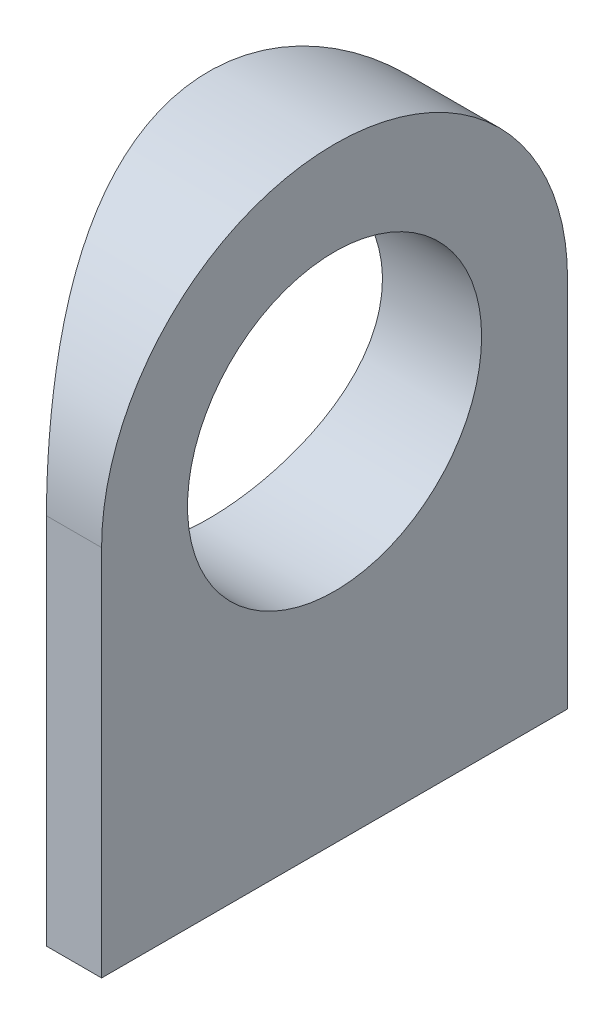
ISO-10303-21;
HEADER;
FILE_DESCRIPTION(('STEP AP214'),'2;1');
FILE_NAME('part.step','',(''),(''),'','','');
FILE_SCHEMA(('AUTOMOTIVE_DESIGN { 1 0 10303 214 1 1 1 1 }'));
ENDSEC;
DATA;
#1=APPLICATION_CONTEXT('core data for automotive mechanical design processes');
#2=APPLICATION_PROTOCOL_DEFINITION('international standard','automotive_design',2000,#1);
#3=PRODUCT_CONTEXT('',#1,'mechanical');
#4=PRODUCT('Part','Part','',(#3));
#5=PRODUCT_RELATED_PRODUCT_CATEGORY('part','',(#4));
#6=PRODUCT_DEFINITION_FORMATION('','',#4);
#7=PRODUCT_DEFINITION_CONTEXT('part definition',#1,'design');
#8=PRODUCT_DEFINITION('design','',#6,#7);
#9=PRODUCT_DEFINITION_SHAPE('','',#8);
#10=(LENGTH_UNIT() NAMED_UNIT(*) SI_UNIT(.MILLI.,.METRE.));
#11=(NAMED_UNIT(*) PLANE_ANGLE_UNIT() SI_UNIT($,.RADIAN.));
#12=(NAMED_UNIT(*) SI_UNIT($,.STERADIAN.) SOLID_ANGLE_UNIT());
#13=UNCERTAINTY_MEASURE_WITH_UNIT(LENGTH_MEASURE(1.E-05),#10,'distance_accuracy_value','');
#14=(GEOMETRIC_REPRESENTATION_CONTEXT(3) GLOBAL_UNCERTAINTY_ASSIGNED_CONTEXT((#13)) GLOBAL_UNIT_ASSIGNED_CONTEXT((#10,
#11,#12)) REPRESENTATION_CONTEXT('',''));
#15=CARTESIAN_POINT('',(0.,0.,0.));
#16=DIRECTION('',(0.,0.,1.));
#17=DIRECTION('',(1.,0.,0.));
#18=AXIS2_PLACEMENT_3D('',#15,#16,#17);
#19=CARTESIAN_POINT('',(0.,0.,0.));
#20=DIRECTION('',(0.,1.,0.));
#21=DIRECTION('',(1.,0.,0.));
#22=AXIS2_PLACEMENT_3D('',#19,#20,#21);
#23=CYLINDRICAL_SURFACE('',#22,28.575);
#24=CARTESIAN_POINT('',(0.,31.75,0.));
#25=DIRECTION('',(0.,1.,0.));
#26=DIRECTION('',(0.,0.,1.));
#27=AXIS2_PLACEMENT_3D('',#24,#25,#26);
#28=CIRCLE('',#27,28.575);
#29=CARTESIAN_POINT('',(-23.7595244060145,31.75,15.875));
#30=VERTEX_POINT('',#29);
#31=CARTESIAN_POINT('',(-23.7595244060145,31.75,-15.875));
#32=VERTEX_POINT('',#31);
#33=EDGE_CURVE('E69',#30,#32,#28,.F.);
#34=ORIENTED_EDGE('',*,*,#33,.F.);
#35=DIRECTION('',(0.,1.,0.));
#36=VECTOR('',#35,1.);
#37=CARTESIAN_POINT('',(-23.7595244060145,0.,15.875));
#38=LINE('',#37,#36);
#39=CARTESIAN_POINT('',(-23.7595244060145,57.1499999589797,15.875));
#40=VERTEX_POINT('',#39);
#41=EDGE_CURVE('E76',#30,#40,#38,.T.);
#42=ORIENTED_EDGE('',*,*,#41,.T.);
#43=CARTESIAN_POINT('',(-23.7595244060145,57.1499999179593,15.875));
#44=CARTESIAN_POINT('',(-23.7595185449954,57.3541036950999,15.8750019816183));
#45=CARTESIAN_POINT('',(-23.7621555680952,57.5581772709929,15.8710628454371));
#46=CARTESIAN_POINT('',(-23.7726559492257,57.9658758219559,15.8553330107876));
#47=CARTESIAN_POINT('',(-23.7805190161914,58.1695008213759,15.8435427495884));
#48=CARTESIAN_POINT('',(-23.8118370036421,58.7787349560772,15.7964730636468));
#49=CARTESIAN_POINT('',(-23.8430209545626,59.1831264803976,15.7494945981294));
#50=CARTESIAN_POINT('',(-23.92446405931,59.982326208514,15.6254934749382));
#51=CARTESIAN_POINT('',(-23.9745894180464,60.3771814255318,15.5486814469622));
#52=CARTESIAN_POINT('',(-24.092046322525,61.1575591658411,15.3660566010382));
#53=CARTESIAN_POINT('',(-24.1593805741403,61.5430802110108,15.2602392221887));
#54=CARTESIAN_POINT('',(-24.3086994034816,62.3012782026588,15.0212357030639));
#55=CARTESIAN_POINT('',(-24.3906399134186,62.673989869078,14.8881317114165));
#56=CARTESIAN_POINT('',(-24.5667570724635,63.4059388073287,14.5956906387931));
#57=CARTESIAN_POINT('',(-24.6609334628652,63.7651763638397,14.4363541124387));
#58=CARTESIAN_POINT('',(-24.8590615946505,64.4693100244829,14.0924486937061));
#59=CARTESIAN_POINT('',(-24.9630292178947,64.8141814725493,13.9078385784149));
#60=CARTESIAN_POINT('',(-25.1780281922563,65.4878695908405,13.5147226038935));
#61=CARTESIAN_POINT('',(-25.2890621468022,65.8166802640544,13.3062079146287));
#62=CARTESIAN_POINT('',(-25.5272180363911,66.4898539387265,12.8439126350057));
#63=CARTESIAN_POINT('',(-25.6548236990183,66.8323662960165,12.5876834820811));
#64=CARTESIAN_POINT('',(-25.9122324335821,67.4951467342908,12.0488995160386));
#65=CARTESIAN_POINT('',(-26.0420356373702,67.8154134746218,11.7663431186829));
#66=CARTESIAN_POINT('',(-26.300794497628,68.4325218853154,11.1759896631967));
#67=CARTESIAN_POINT('',(-26.4297496520425,68.7293506557452,10.868178892833));
#68=CARTESIAN_POINT('',(-26.6837098858186,69.2978401617226,10.2288094213462));
#69=CARTESIAN_POINT('',(-26.8087162405385,69.569509079151,9.8972585030535));
#70=CARTESIAN_POINT('',(-27.0627817843816,70.1091968212958,9.18113864685375));
#71=CARTESIAN_POINT('',(-27.1912132491409,70.3747438965267,8.79447674634559));
#72=CARTESIAN_POINT('',(-27.4365111371155,70.8720234721498,7.99642044158475));
#73=CARTESIAN_POINT('',(-27.5533763262259,71.1037523654404,7.58502340564106));
#74=CARTESIAN_POINT('',(-27.7720562237305,71.530740516437,6.74044389595936));
#75=CARTESIAN_POINT('',(-27.8738869386949,71.7260386197109,6.3072852593269));
#76=CARTESIAN_POINT('',(-28.0595483764157,72.0780151040003,5.42187984065071));
#77=CARTESIAN_POINT('',(-28.143383908259,72.234703804769,4.96963819716195));
#78=CARTESIAN_POINT('',(-28.2748619667015,72.478436176506,4.14703039759606));
#79=CARTESIAN_POINT('',(-28.3264090102618,72.5732000438172,3.77955517983045));
#80=CARTESIAN_POINT('',(-28.415593139758,72.7363921493634,3.03716632177805));
#81=CARTESIAN_POINT('',(-28.4532323807093,72.8048244677423,2.66225384338965));
#82=CARTESIAN_POINT('',(-28.5137795279209,72.9146033722549,1.90743479240228));
#83=CARTESIAN_POINT('',(-28.5366925615837,72.9559593859683,1.5275300051014));
#84=CARTESIAN_POINT('',(-28.5673039065729,73.0111594067928,0.765085829917072));
#85=CARTESIAN_POINT('',(-28.5750009677103,73.0250011532514,0.382546228140511));
#86=CARTESIAN_POINT('',(-28.574998958135,73.0249987583748,-0.411875152071524));
#87=CARTESIAN_POINT('',(-28.5660749342509,73.0089518578354,-0.823759178626309));
#88=CARTESIAN_POINT('',(-28.5306085578558,72.9449778476041,-1.64428340726461));
#89=CARTESIAN_POINT('',(-28.5040652968216,72.8970490939475,-2.05292344097438));
#90=CARTESIAN_POINT('',(-28.4340276857562,72.7699149347383,-2.86399304271879));
#91=CARTESIAN_POINT('',(-28.3905264079419,72.6906967464773,-3.26642000261373));
#92=CARTESIAN_POINT('',(-28.2876581465761,72.5019658839245,-4.0620106345857));
#93=CARTESIAN_POINT('',(-28.2282911919478,72.3924532648594,-4.45517432354826));
#94=CARTESIAN_POINT('',(-28.0953727558616,72.1448601198084,-5.22818158420869));
#95=CARTESIAN_POINT('',(-28.0218771887435,72.0068920550984,-5.6080709083486));
#96=CARTESIAN_POINT('',(-27.86222212699,71.7035237245303,-6.35394997733145));
#97=CARTESIAN_POINT('',(-27.7760626584994,71.538123515306,-6.71993975086822));
#98=CARTESIAN_POINT('',(-27.5929365134925,71.1813428629844,-7.43620487874514));
#99=CARTESIAN_POINT('',(-27.4959694103495,70.989961394223,-7.7864796119748));
#100=CARTESIAN_POINT('',(-27.2932238692133,70.5826567460207,-8.46980531980094));
#101=CARTESIAN_POINT('',(-27.1874444633804,70.366730869959,-8.80285439600591));
#102=CARTESIAN_POINT('',(-26.9616060637152,69.8959320583681,-9.47290518659535));
#103=CARTESIAN_POINT('',(-26.8410655463998,69.6393959913375,-9.80857627060494));
#104=CARTESIAN_POINT('',(-26.595006475364,69.1014262762434,-10.4573731738906));
#105=CARTESIAN_POINT('',(-26.4694877284543,68.8199916614232,-10.7704981168919));
#106=CARTESIAN_POINT('',(-26.2161210069713,68.2333238748742,-11.3733301948794));
#107=CARTESIAN_POINT('',(-26.0882705726016,67.9280643054817,-11.6630106088609));
#108=CARTESIAN_POINT('',(-25.8333019110134,67.2953601076675,-12.2173748744353));
#109=CARTESIAN_POINT('',(-25.7061837118304,66.9679146358453,-12.482057774827));
#110=CARTESIAN_POINT('',(-25.442910970626,66.2574891033449,-13.0109496940141));
#111=CARTESIAN_POINT('',(-25.3071592737872,65.872252603727,-13.2723501239297));
#112=CARTESIAN_POINT('',(-25.1102389402849,65.2767575672019,-13.6391279623406));
#113=CARTESIAN_POINT('',(-25.0457122003876,65.0753037143789,-13.7571745216748));
#114=CARTESIAN_POINT('',(-24.9194067875935,64.6666234806746,-13.9846600340369));
#115=CARTESIAN_POINT('',(-24.8576293835711,64.4593945047544,-14.0940950301899));
#116=CARTESIAN_POINT('',(-24.6776399891972,63.8307036455338,-14.4084323410173));
#117=CARTESIAN_POINT('',(-24.5643789790825,63.4010697383709,-14.6000875265463));
#118=CARTESIAN_POINT('',(-24.3557050375835,62.5228117226683,-14.9456038655902));
#119=CARTESIAN_POINT('',(-24.2602862671545,62.0741938859486,-15.0994773886977));
#120=CARTESIAN_POINT('',(-24.109844518244,61.2601279697498,-15.3382318105739));
#121=CARTESIAN_POINT('',(-24.0505485310254,60.8977235801906,-15.430837680791));
#122=CARTESIAN_POINT('',(-23.9473463001272,60.165257126823,-15.5905193491952));
#123=CARTESIAN_POINT('',(-23.9034356994982,59.7951972624386,-15.6576023755958));
#124=CARTESIAN_POINT('',(-23.832254427208,59.0475018238533,-15.7657390877415));
#125=CARTESIAN_POINT('',(-23.8050785079497,58.669835392397,-15.8066446056856));
#126=CARTESIAN_POINT('',(-23.7777994701344,58.101170151013,-15.8476215674158));
#127=CARTESIAN_POINT('',(-23.7709538872643,57.9111612024642,-15.857883693888));
#128=CARTESIAN_POINT('',(-23.7618139811126,57.5307762845256,-15.8715738932832));
#129=CARTESIAN_POINT('',(-23.7595199426581,57.3404002929131,-15.8750015385171));
#130=CARTESIAN_POINT('',(-23.7595244060145,57.15,-15.875));
#131=B_SPLINE_CURVE_WITH_KNOTS('',3,(#43,#44,#45,#46,#47,#48,#49,#50,#51,#52,#53,#54,#55,#56,
#57,#58,#59,#60,#61,#62,#63,#64,#65,#66,#67,#68,#69,#70,#71,#72,#73,#74,#75,#76,#77,#78,#79,#80,
#81,#82,#83,#84,#85,#86,#87,#88,#89,#90,#91,#92,#93,#94,#95,#96,#97,#98,#99,#100,#101,#102,#103,
#104,#105,#106,#107,#108,#109,#110,#111,#112,#113,#114,#115,#116,#117,#118,#119,#120,#121,#122,
#123,#124,#125,#126,#127,#128,#129,#130),.UNSPECIFIED.,.F.,.F.,(4,2,2,2,2,2,2,2,2,2,2,2,2,2,2,2,
2,2,2,2,2,2,2,2,2,2,2,2,2,2,2,2,2,2,2,2,2,2,2,2,2,2,2,4),(0.,0.612196826465882,1.22435955943094,
2.44742016997927,3.66199830405942,4.87676753226803,6.08793193302636,7.29907073001534,
8.51220904834623,9.72579693669353,11.0635477301327,12.4013790745652,13.7399416833989,
15.0780674573553,16.5351577570846,17.9924033589924,19.4480861285394,20.9033793913673,
22.0511733961798,23.1987894755484,24.346005758704,25.4933162966036,26.7285417273945,
27.9638308566323,29.1996251627878,30.4354172161058,31.6664156922091,32.8974116269371,
34.1284561719223,35.3596360990591,36.676284932434,37.9929849108804,39.3111650671892,
40.629395362471,42.0822421739013,42.8087724159957,43.5356345611148,44.9850924944663,
46.4340752453775,47.5690636859394,48.7037304516741,49.8447640518437,50.4158365883906,
50.9869448604658),.UNSPECIFIED.);
#132=CARTESIAN_POINT('',(-23.7595244060145,57.15,-15.875));
#133=VERTEX_POINT('',#132);
#134=EDGE_CURVE('E160',#40,#133,#131,.T.);
#135=ORIENTED_EDGE('',*,*,#134,.T.);
#136=DIRECTION('',(0.,1.,0.));
#137=VECTOR('',#136,1.);
#138=CARTESIAN_POINT('',(-23.7595244060145,25.4,-15.875));
#139=LINE('',#138,#137);
#140=EDGE_CURVE('E123',#32,#133,#139,.T.);
#141=ORIENTED_EDGE('',*,*,#140,.F.);
#142=EDGE_LOOP('',(#34,#42,#135,#141));
#143=FACE_BOUND('',#142,.T.);
#144=CARTESIAN_POINT('',(-26.7604972470618,56.6547,-10.0203));
#145=CARTESIAN_POINT('',(-26.7604967773269,56.3827398395807,-10.0203005547588));
#146=CARTESIAN_POINT('',(-26.7646542243898,56.1107877241153,-10.0092190385472));
#147=CARTESIAN_POINT('',(-26.7811456144108,55.5689409186536,-9.96500984839057));
#148=CARTESIAN_POINT('',(-26.7934792483995,55.2990461513021,-9.93188300751491));
#149=CARTESIAN_POINT('',(-26.8259230193403,54.7632862622044,-9.84391534424536));
#150=CARTESIAN_POINT('',(-26.8460335729712,54.4974213571673,-9.78907335837402));
#151=CARTESIAN_POINT('',(-26.8933932696376,53.9716123624513,-9.65820158265294));
#152=CARTESIAN_POINT('',(-26.9206425336972,53.7116683732322,-9.58217143359474));
#153=CARTESIAN_POINT('',(-26.9813713023381,53.2000567181724,-9.40981120420015));
#154=CARTESIAN_POINT('',(-27.0148358480879,52.9483708531126,-9.31352979204697));
#155=CARTESIAN_POINT('',(-27.0870694544618,52.4541140888554,-9.10131049067278));
#156=CARTESIAN_POINT('',(-27.1258404856502,52.2115466186303,-8.98536529545887));
#157=CARTESIAN_POINT('',(-27.2075867896465,51.7370591966615,-8.73471316352276));
#158=CARTESIAN_POINT('',(-27.25056202367,51.5051391467234,-8.60000639987301));
#159=CARTESIAN_POINT('',(-27.3395597643101,51.0532355448738,-8.31274332271805));
#160=CARTESIAN_POINT('',(-27.3855824687015,50.8332527693567,-8.16018585024334));
#161=CARTESIAN_POINT('',(-27.4813272333566,50.3980266674725,-7.83183599458581));
#162=CARTESIAN_POINT('',(-27.5311236035201,50.1833112921518,-7.65536512013847));
#163=CARTESIAN_POINT('',(-27.6313573827249,49.7693504489336,-7.28529053625814));
#164=CARTESIAN_POINT('',(-27.6817948051742,49.5701053052264,-7.09168646796788));
#165=CARTESIAN_POINT('',(-27.7819749782004,49.188249820029,-6.68847105708574));
#166=CARTESIAN_POINT('',(-27.8317175919264,49.0056427175469,-6.47885661221473));
#167=CARTESIAN_POINT('',(-27.929183144308,48.6582723339971,-6.04489877854992));
#168=CARTESIAN_POINT('',(-27.9769061442007,48.4935085116639,-5.82055583686827));
#169=CARTESIAN_POINT('',(-28.0704375840149,48.1783463860372,-5.3516332298691));
#170=CARTESIAN_POINT('',(-28.1161478166019,48.028516253636,-5.10665152479481));
#171=CARTESIAN_POINT('',(-28.2027863982638,47.750182121696,-4.60417485209951));
#172=CARTESIAN_POINT('',(-28.243716645695,47.6216696473327,-4.34668491000962));
#173=CARTESIAN_POINT('',(-28.3196426616972,47.3869990991667,-3.82086576052517));
#174=CARTESIAN_POINT('',(-28.3546385531181,47.280840562594,-3.55253677765698));
#175=CARTESIAN_POINT('',(-28.4176710630547,47.0918678701483,-3.00698765995258));
#176=CARTESIAN_POINT('',(-28.4457080142197,47.0090525984015,-2.72976795082397));
#177=CARTESIAN_POINT('',(-28.493064689745,46.8702935671196,-2.17928268243948));
#178=CARTESIAN_POINT('',(-28.5126763764707,46.8134445476715,-1.90627028248793));
#179=CARTESIAN_POINT('',(-28.5441372028119,46.7226622470807,-1.35601789908876));
#180=CARTESIAN_POINT('',(-28.5559865225251,46.6887284342727,-1.07877801387741));
#181=CARTESIAN_POINT('',(-28.5715824260239,46.6441282631278,-0.522273529441565));
#182=CARTESIAN_POINT('',(-28.5753309883906,46.63345622318,-0.243009441345039));
#183=CARTESIAN_POINT('',(-28.5746231381827,46.6354745949542,0.315420289738276));
#184=CARTESIAN_POINT('',(-28.5701669384676,46.64816440059,0.594585935091076));
#185=CARTESIAN_POINT('',(-28.5535485523671,46.695714777152,1.13855358097871));
#186=CARTESIAN_POINT('',(-28.5417293049651,46.7295889310609,1.403453009594));
#187=CARTESIAN_POINT('',(-28.5110119147982,46.8182719322909,1.92929650258286));
#188=CARTESIAN_POINT('',(-28.4921140142125,46.8730800634071,2.19024070195742));
#189=CARTESIAN_POINT('',(-28.4477291102099,47.0031296846562,2.70636679665257));
#190=CARTESIAN_POINT('',(-28.4222430388072,47.0783682846113,2.96154950149139));
#191=CARTESIAN_POINT('',(-28.3653150486709,47.2486740668879,3.46462715942482));
#192=CARTESIAN_POINT('',(-28.3338708692357,47.3437487770689,3.71251930486367));
#193=CARTESIAN_POINT('',(-28.265357261355,47.5543564556867,4.20264879201673));
#194=CARTESIAN_POINT('',(-28.2282181032698,47.6701464835069,4.44476585448199));
#195=CARTESIAN_POINT('',(-28.1495460046106,47.9204659123492,4.91847152434862));
#196=CARTESIAN_POINT('',(-28.1080114480597,48.0550022112722,5.15005621445));
#197=CARTESIAN_POINT('',(-28.0215798551413,48.3418530893704,5.6012916152246));
#198=CARTESIAN_POINT('',(-27.9766826266056,48.4941686848655,5.82094164262254));
#199=CARTESIAN_POINT('',(-27.8846205460516,48.8155956785203,6.24708669079356));
#200=CARTESIAN_POINT('',(-27.8374556024037,48.9847077556561,6.45358117921664));
#201=CARTESIAN_POINT('',(-27.7395199752296,49.3479288852366,6.86266451895705));
#202=CARTESIAN_POINT('',(-27.6886893459485,49.542880607942,7.06449155071677));
#203=CARTESIAN_POINT('',(-27.5871838534924,49.9489470172727,7.4510291784114));
#204=CARTESIAN_POINT('',(-27.5365089349599,50.1600550388386,7.63574676384115));
#205=CARTESIAN_POINT('',(-27.4366565567088,50.5973701151153,7.98710751604477));
#206=CARTESIAN_POINT('',(-27.3874800366089,50.8235863712696,8.15373950287863));
#207=CARTESIAN_POINT('',(-27.2920696196064,51.2895509049769,8.46761271027669));
#208=CARTESIAN_POINT('',(-27.2458345600489,51.5292937643488,8.61486161719962));
#209=CARTESIAN_POINT('',(-27.1568597229426,52.0252965815788,8.89140473829269));
#210=CARTESIAN_POINT('',(-27.1141965788179,52.2817742232755,9.02033375017122));
#211=CARTESIAN_POINT('',(-27.0346744872834,52.8054979434982,9.25594219085735));
#212=CARTESIAN_POINT('',(-26.997813105629,53.0727394464064,9.36263095713004));
#213=CARTESIAN_POINT('',(-26.9311022918764,53.6161572253756,9.55282790711331));
#214=CARTESIAN_POINT('',(-26.9012516711159,53.8923319777724,9.63634002082171));
#215=CARTESIAN_POINT('',(-26.8495910442064,54.4515629157539,9.77936000259115));
#216=CARTESIAN_POINT('',(-26.8277805693218,54.7346186991527,9.83886927002266));
#217=CARTESIAN_POINT('',(-26.7938394826053,55.2912646741243,9.93091498779895));
#218=CARTESIAN_POINT('',(-26.7812846109926,55.5646334260793,9.96463670899314));
#219=CARTESIAN_POINT('',(-26.7645646233729,56.1134730426589,10.0094597605695));
#220=CARTESIAN_POINT('',(-26.7603992315581,56.388943837879,10.0205618345823));
#221=CARTESIAN_POINT('',(-26.7605987609918,56.9398076337586,10.0200288224317));
#222=CARTESIAN_POINT('',(-26.7649621109847,57.2152006394009,10.0083979243789));
#223=CARTESIAN_POINT('',(-26.7820688071601,57.763830607086,9.96253044314666));
#224=CARTESIAN_POINT('',(-26.7948120282976,58.0370676012395,9.92829419728552));
#225=CARTESIAN_POINT('',(-26.8275879288737,58.5685482385536,9.83937455052104));
#226=CARTESIAN_POINT('',(-26.8473112004569,58.8269565266165,9.78555667103021));
#227=CARTESIAN_POINT('',(-26.8935082659928,59.3382467317114,9.65786954672451));
#228=CARTESIAN_POINT('',(-26.9199844393246,59.5911266666644,9.58399323374464));
#229=CARTESIAN_POINT('',(-26.9789086469443,60.0896016314391,9.41684422357627));
#230=CARTESIAN_POINT('',(-27.0113552991871,60.3351983319366,9.32357601457181));
#231=CARTESIAN_POINT('',(-27.0813319866059,60.8177956256364,9.11832416417593));
#232=CARTESIAN_POINT('',(-27.1188639899832,61.0547928453022,9.00633327253479));
#233=CARTESIAN_POINT('',(-27.1993336657106,61.5265974966787,8.76037496062495));
#234=CARTESIAN_POINT('',(-27.2424110661163,61.7610608275413,8.62579320626053));
#235=CARTESIAN_POINT('',(-27.331750246699,62.2180266738377,8.3383872043029));
#236=CARTESIAN_POINT('',(-27.3780134443899,62.4405237854809,8.18555481363357));
#237=CARTESIAN_POINT('',(-27.472485495123,62.8722250085107,7.8626620994709));
#238=CARTESIAN_POINT('',(-27.5206944724064,63.081428268861,7.69260067482591));
#239=CARTESIAN_POINT('',(-27.6178175246582,63.4853716876376,7.33627136381015));
#240=CARTESIAN_POINT('',(-27.6667316185321,63.680111457407,7.15000304222635));
#241=CARTESIAN_POINT('',(-27.7666845865862,64.0642072385254,6.75175888594721));
#242=CARTESIAN_POINT('',(-27.8176942259276,64.2526934993238,6.5389356811364));
#243=CARTESIAN_POINT('',(-27.9177018668849,64.6110475660559,6.0978409011709));
#244=CARTESIAN_POINT('',(-27.9667005804432,64.78092199746,5.8695748704911));
#245=CARTESIAN_POINT('',(-28.0613751753061,65.1009980659283,5.3988423706612));
#246=CARTESIAN_POINT('',(-28.1070496906239,65.251191635756,5.1563701369177));
#247=CARTESIAN_POINT('',(-28.1937640487232,65.5306087736863,4.65896848742148));
#248=CARTESIAN_POINT('',(-28.2348058553921,65.6598412378018,4.40404441638489));
#249=CARTESIAN_POINT('',(-28.3109130435871,65.8956946397095,3.88475382516941));
#250=CARTESIAN_POINT('',(-28.3460092862676,66.0024330879057,3.62044525496584));
#251=CARTESIAN_POINT('',(-28.4094910040577,66.1932042706834,3.08296334029573));
#252=CARTESIAN_POINT('',(-28.4378764620879,66.2772369474771,2.80978997326963));
#253=CARTESIAN_POINT('',(-28.4871011924118,66.4217537969539,2.25670972004109));
#254=CARTESIAN_POINT('',(-28.5079429851776,66.4822458354893,1.97680511625992));
#255=CARTESIAN_POINT('',(-28.5414739749792,66.5790939136336,1.41237244003092));
#256=CARTESIAN_POINT('',(-28.5541635692206,66.6154511291846,1.12784459353752));
#257=CARTESIAN_POINT('',(-28.5705755664706,66.6623982845389,0.5712418487712));
#258=CARTESIAN_POINT('',(-28.5747273622083,66.6742223708188,0.299282995372439));
#259=CARTESIAN_POINT('',(-28.5752465691433,66.6757032888029,-0.244696856966869));
#260=CARTESIAN_POINT('',(-28.5716142654421,66.6653609323778,-0.516717853266493));
#261=CARTESIAN_POINT('',(-28.5566651786535,66.6226141068139,-1.05877818420341));
#262=CARTESIAN_POINT('',(-28.5453491164888,66.5902117074407,-1.32881770234895));
#263=CARTESIAN_POINT('',(-28.5153398006482,66.5036611957778,-1.86497006483628));
#264=CARTESIAN_POINT('',(-28.4966465363207,66.4495130520909,-2.13108290350802));
#265=CARTESIAN_POINT('',(-28.4528126088543,66.3212344589545,-2.65239164488811));
#266=CARTESIAN_POINT('',(-28.4278038851586,66.2475115051307,-2.90769916728771));
#267=CARTESIAN_POINT('',(-28.3717962892208,66.0802409031874,-3.41115516267765));
#268=CARTESIAN_POINT('',(-28.3407952816797,65.9866861870367,-3.65930104734449));
#269=CARTESIAN_POINT('',(-28.2735855366598,65.7805377307079,-4.14674690197409));
#270=CARTESIAN_POINT('',(-28.2373779985843,65.6679483744015,-4.38604889334614));
#271=CARTESIAN_POINT('',(-28.1606161644994,65.4245023755891,-4.85455467987939));
#272=CARTESIAN_POINT('',(-28.1200601940378,65.2936386902736,-5.08375453672365));
#273=CARTESIAN_POINT('',(-28.0339410207323,65.0091431764011,-5.53936768229341));
#274=CARTESIAN_POINT('',(-27.988244516441,64.854824439718,-5.76532697038428));
#275=CARTESIAN_POINT('',(-27.8943654230182,64.5284438565158,-6.20364986038033));
#276=CARTESIAN_POINT('',(-27.8461817150604,64.3563739895821,-6.4160072457395));
#277=CARTESIAN_POINT('',(-27.7485692870266,63.9956151274212,-6.82582650260313));
#278=CARTESIAN_POINT('',(-27.6991404595272,63.806924694714,-7.02328708296482));
#279=CARTESIAN_POINT('',(-27.6003079766934,63.4140584540774,-7.40215927596615));
#280=CARTESIAN_POINT('',(-27.5509043217833,63.2098823933783,-7.58357062653157));
#281=CARTESIAN_POINT('',(-27.4512199812329,62.7777237174752,-7.93702496838599));
#282=CARTESIAN_POINT('',(-27.4009993713735,62.549084030464,-8.1082826301682));
#283=CARTESIAN_POINT('',(-27.3034756981471,62.0776805480437,-8.43084997612507));
#284=CARTESIAN_POINT('',(-27.2561715435065,61.8349221024553,-8.58216714599861));
#285=CARTESIAN_POINT('',(-27.1658759457349,61.3366481067645,-8.86384234416094));
#286=CARTESIAN_POINT('',(-27.1228859696417,61.0811282610834,-8.99419325188767));
#287=CARTESIAN_POINT('',(-27.0426143575699,60.5592125066089,-9.23273941125029));
#288=CARTESIAN_POINT('',(-27.0053301961693,60.2928214759726,-9.34094447194454));
#289=CARTESIAN_POINT('',(-26.9379986011975,59.753482618995,-9.53337085278014));
#290=CARTESIAN_POINT('',(-26.9078863622408,59.4806200968425,-9.61780830952645));
#291=CARTESIAN_POINT('',(-26.8554706718442,58.9279668903313,-9.76321179855655));
#292=CARTESIAN_POINT('',(-26.8331671908874,58.6481762321651,-9.82417791956155));
#293=CARTESIAN_POINT('',(-26.7971602689062,58.0839670862519,-9.92197301042143));
#294=CARTESIAN_POINT('',(-26.7834535203563,57.7995504215875,-9.95881126352676));
#295=CARTESIAN_POINT('',(-26.7651224676519,57.2283194476996,-10.0079738975669));
#296=CARTESIAN_POINT('',(-26.7604977424374,56.9415052502495,-10.0202994149594));
#297=CARTESIAN_POINT('',(-26.7604972470618,56.6547,-10.0203));
#298=B_SPLINE_CURVE_WITH_KNOTS('',3,(#144,#145,#146,#147,#148,#149,#150,#151,#152,#153,#154,
#155,#156,#157,#158,#159,#160,#161,#162,#163,#164,#165,#166,#167,#168,#169,#170,#171,#172,#173,
#174,#175,#176,#177,#178,#179,#180,#181,#182,#183,#184,#185,#186,#187,#188,#189,#190,#191,#192,
#193,#194,#195,#196,#197,#198,#199,#200,#201,#202,#203,#204,#205,#206,#207,#208,#209,#210,#211,
#212,#213,#214,#215,#216,#217,#218,#219,#220,#221,#222,#223,#224,#225,#226,#227,#228,#229,#230,
#231,#232,#233,#234,#235,#236,#237,#238,#239,#240,#241,#242,#243,#244,#245,#246,#247,#248,#249,
#250,#251,#252,#253,#254,#255,#256,#257,#258,#259,#260,#261,#262,#263,#264,#265,#266,#267,#268,
#269,#270,#271,#272,#273,#274,#275,#276,#277,#278,#279,#280,#281,#282,#283,#284,#285,#286,#287,
#288,#289,#290,#291,#292,#293,#294,#295,#296,#297),.UNSPECIFIED.,.T.,.F.,(4,2,2,2,2,2,2,2,2,2,2,
2,2,2,2,2,2,2,2,2,2,2,2,2,2,2,2,2,2,2,2,2,2,2,2,2,2,2,2,2,2,2,2,2,2,2,2,2,2,2,2,2,2,2,2,2,2,2,2,
2,2,2,2,2,2,2,2,2,2,2,2,2,2,2,2,2,4),(0.,0.815610608130645,1.63119039695066,2.44681388969854,
3.26245121076572,4.07615032776097,4.89015243611575,5.70414703592886,6.51819451425397,
7.3643052942853,8.21043380042763,9.05672667613405,9.90299387284341,10.7742611592801,
11.6451812393714,12.5160832879452,13.3869436978839,14.2245535374025,15.0621439425175,
15.8995297460188,16.7368938251704,17.5379053724972,18.3388895176238,19.1397604112293,
19.9409357922394,20.7528464911388,21.5650567345223,22.3773134291311,23.1896029715438,
24.0441432607733,24.8983329019749,25.7530476041302,26.6074223415832,27.476966427788,
28.3461447013339,29.2151755006614,30.084155628004,30.9102889557928,31.7363951236549,
32.5623491117736,33.3882907752346,34.1814493306756,34.9748877418579,35.7681427186113,
36.5617055933038,37.3820617226814,38.2027852561812,39.0235612773539,39.844359346099,
40.7098264037974,41.5749843631251,42.4404958509461,43.3056390441148,44.1661440336804,
45.0266512132729,45.8868706162117,46.7470481028531,47.5627873537091,48.378496727712,
49.1941295789871,50.0097636079075,50.809594293632,51.6097105193641,52.4096427205799,
53.2098840657691,54.0412072470248,54.8729077002587,55.7046801563995,56.5364661923755,
57.4055657980711,58.2743382069949,59.1434050482382,60.0120861167081,60.872591670954,
61.7330939724734,62.5932649990402,63.4533961454931),.UNSPECIFIED.);
#299=CARTESIAN_POINT('',(-26.7604972470618,56.6547,-10.0203));
#300=VERTEX_POINT('',#299);
#301=EDGE_CURVE('E161',#300,#300,#298,.T.);
#302=ORIENTED_EDGE('',*,*,#301,.F.);
#303=EDGE_LOOP('',(#302));
#304=FACE_BOUND('',#303,.T.);
#305=ADVANCED_FACE('F53',(#143,#304),#23,.T.);
#306=CARTESIAN_POINT('',(-103.07574,57.15,0.));
#307=DIRECTION('',(1.,0.,0.));
#308=DIRECTION('',(0.,1.,0.));
#309=AXIS2_PLACEMENT_3D('',#306,#307,#308);
#310=CYLINDRICAL_SURFACE('',#309,15.875);
#311=DIRECTION('',(1.,0.,0.));
#312=VECTOR('',#311,1.);
#313=CARTESIAN_POINT('',(-103.07574,57.15,-15.875));
#314=LINE('',#313,#312);
#315=CARTESIAN_POINT('',(-20.0025,57.15,-15.875));
#316=VERTEX_POINT('',#315);
#317=EDGE_CURVE('E63',#316,#133,#314,.F.);
#318=ORIENTED_EDGE('',*,*,#317,.T.);
#319=ORIENTED_EDGE('',*,*,#134,.F.);
#320=DIRECTION('',(1.,0.,0.));
#321=VECTOR('',#320,1.);
#322=CARTESIAN_POINT('',(-103.07574,57.15,15.875));
#323=LINE('',#322,#321);
#324=CARTESIAN_POINT('',(-20.0025,57.15,15.875));
#325=VERTEX_POINT('',#324);
#326=EDGE_CURVE('E261',#40,#325,#323,.T.);
#327=ORIENTED_EDGE('',*,*,#326,.T.);
#328=CARTESIAN_POINT('',(-20.0025,57.15,0.));
#329=DIRECTION('',(1.,0.,0.));
#330=DIRECTION('',(0.,0.,-1.));
#331=AXIS2_PLACEMENT_3D('',#328,#329,#330);
#332=CIRCLE('',#331,15.875);
#333=EDGE_CURVE('E113',#325,#316,#332,.F.);
#334=ORIENTED_EDGE('',*,*,#333,.T.);
#335=EDGE_LOOP('',(#318,#319,#327,#334));
#336=FACE_BOUND('',#335,.T.);
#337=ADVANCED_FACE('F55',(#336),#310,.T.);
#338=CARTESIAN_POINT('',(-20.0025,73.025,-31.75));
#339=DIRECTION('',(-1.,0.,0.));
#340=DIRECTION('',(0.,-1.,0.));
#341=AXIS2_PLACEMENT_3D('',#338,#339,#340);
#342=PLANE('',#341);
#343=CARTESIAN_POINT('',(-20.0025,56.6547,0.));
#344=DIRECTION('',(1.,0.,0.));
#345=DIRECTION('',(0.,0.,-1.));
#346=AXIS2_PLACEMENT_3D('',#343,#344,#345);
#347=CIRCLE('',#346,10.0203);
#348=CARTESIAN_POINT('',(-20.0025,56.6547,-10.0203));
#349=VERTEX_POINT('',#348);
#350=EDGE_CURVE('E121',#349,#349,#347,.T.);
#351=ORIENTED_EDGE('',*,*,#350,.F.);
#352=EDGE_LOOP('',(#351));
#353=FACE_BOUND('',#352,.T.);
#354=DIRECTION('',(0.,-1.,0.));
#355=VECTOR('',#354,1.);
#356=CARTESIAN_POINT('',(-20.0025,57.15,15.875));
#357=LINE('',#356,#355);
#358=CARTESIAN_POINT('',(-20.0025,31.75,15.875));
#359=VERTEX_POINT('',#358);
#360=EDGE_CURVE('E107',#325,#359,#357,.T.);
#361=ORIENTED_EDGE('',*,*,#360,.T.);
#362=DIRECTION('',(0.,0.,1.));
#363=VECTOR('',#362,1.);
#364=CARTESIAN_POINT('',(-20.0025,31.75,-31.75));
#365=LINE('',#364,#363);
#366=CARTESIAN_POINT('',(-20.0025,31.75,-15.875));
#367=VERTEX_POINT('',#366);
#368=EDGE_CURVE('E95',#359,#367,#365,.F.);
#369=ORIENTED_EDGE('',*,*,#368,.T.);
#370=DIRECTION('',(0.,-1.,0.));
#371=VECTOR('',#370,1.);
#372=CARTESIAN_POINT('',(-20.0025,57.15,-15.875));
#373=LINE('',#372,#371);
#374=EDGE_CURVE('E104',#316,#367,#373,.T.);
#375=ORIENTED_EDGE('',*,*,#374,.F.);
#376=ORIENTED_EDGE('',*,*,#333,.F.);
#377=EDGE_LOOP('',(#361,#369,#375,#376));
#378=FACE_BOUND('',#377,.T.);
#379=ADVANCED_FACE('F103',(#353,#378),#342,.F.);
#380=CARTESIAN_POINT('',(-31.75,25.4,15.875));
#381=DIRECTION('',(0.,0.,-1.));
#382=DIRECTION('',(0.,1.,0.));
#383=AXIS2_PLACEMENT_3D('',#380,#381,#382);
#384=PLANE('',#383);
#385=ORIENTED_EDGE('',*,*,#41,.F.);
#386=DIRECTION('',(1.,0.,0.));
#387=VECTOR('',#386,1.);
#388=CARTESIAN_POINT('',(-31.75,31.75,15.875));
#389=LINE('',#388,#387);
#390=EDGE_CURVE('E280',#30,#359,#389,.T.);
#391=ORIENTED_EDGE('',*,*,#390,.T.);
#392=ORIENTED_EDGE('',*,*,#360,.F.);
#393=ORIENTED_EDGE('',*,*,#326,.F.);
#394=EDGE_LOOP('',(#385,#391,#392,#393));
#395=FACE_BOUND('',#394,.T.);
#396=ADVANCED_FACE('F287',(#395),#384,.F.);
#397=CARTESIAN_POINT('',(-31.75,25.4,-15.875));
#398=DIRECTION('',(0.,0.,-1.));
#399=DIRECTION('',(0.,1.,0.));
#400=AXIS2_PLACEMENT_3D('',#397,#398,#399);
#401=PLANE('',#400);
#402=DIRECTION('',(1.,0.,0.));
#403=VECTOR('',#402,1.);
#404=CARTESIAN_POINT('',(-31.75,31.75,-15.875));
#405=LINE('',#404,#403);
#406=EDGE_CURVE('E13',#32,#367,#405,.T.);
#407=ORIENTED_EDGE('',*,*,#406,.F.);
#408=ORIENTED_EDGE('',*,*,#140,.T.);
#409=ORIENTED_EDGE('',*,*,#317,.F.);
#410=ORIENTED_EDGE('',*,*,#374,.T.);
#411=EDGE_LOOP('',(#407,#408,#409,#410));
#412=FACE_BOUND('',#411,.T.);
#413=ADVANCED_FACE('F110',(#412),#401,.T.);
#414=CARTESIAN_POINT('',(-20.0025,56.6547,0.));
#415=DIRECTION('',(1.,0.,0.));
#416=DIRECTION('',(0.,0.,-1.));
#417=AXIS2_PLACEMENT_3D('',#414,#415,#416);
#418=CYLINDRICAL_SURFACE('',#417,10.0203);
#419=ORIENTED_EDGE('',*,*,#301,.T.);
#420=EDGE_LOOP('',(#419));
#421=FACE_BOUND('',#420,.T.);
#422=ORIENTED_EDGE('',*,*,#350,.T.);
#423=EDGE_LOOP('',(#422));
#424=FACE_BOUND('',#423,.T.);
#425=ADVANCED_FACE('F170',(#421,#424),#418,.F.);
#426=CARTESIAN_POINT('',(0.,31.75,0.));
#427=DIRECTION('',(0.,1.,0.));
#428=DIRECTION('',(0.,0.,1.));
#429=AXIS2_PLACEMENT_3D('',#426,#427,#428);
#430=PLANE('',#429);
#431=ORIENTED_EDGE('',*,*,#33,.T.);
#432=ORIENTED_EDGE('',*,*,#406,.T.);
#433=ORIENTED_EDGE('',*,*,#368,.F.);
#434=ORIENTED_EDGE('',*,*,#390,.F.);
#435=EDGE_LOOP('',(#431,#432,#433,#434));
#436=FACE_BOUND('',#435,.T.);
#437=ADVANCED_FACE('F94',(#436),#430,.F.);
#438=CLOSED_SHELL('',(#305,#337,#379,#396,#413,#425,#437));
#439=MANIFOLD_SOLID_BREP('B2',#438);
#440=ADVANCED_BREP_SHAPE_REPRESENTATION('',(#18,#439),#14);
#441=SHAPE_DEFINITION_REPRESENTATION(#9,#440);
ENDSEC;
END-ISO-10303-21;
